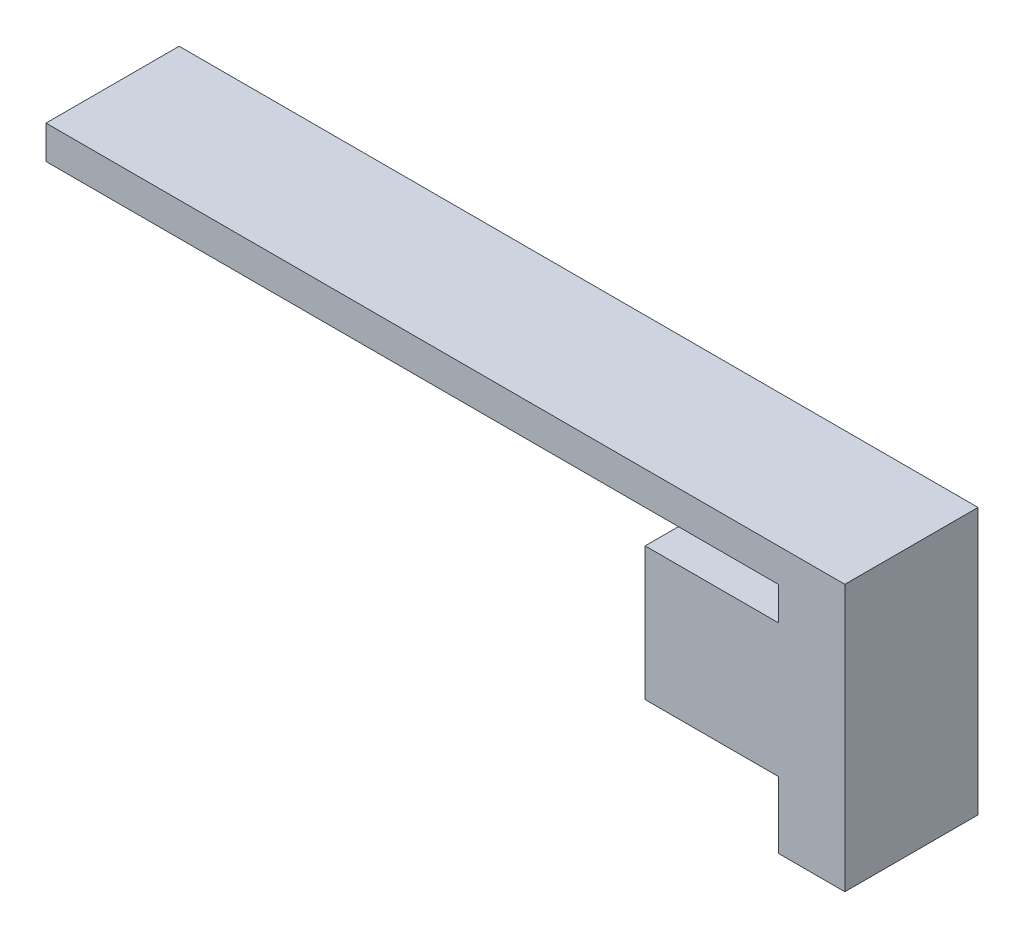
ISO-10303-21;
HEADER;
FILE_DESCRIPTION(('STEP AP214'),'2;1');
FILE_NAME('part.step','',(''),(''),'','','');
FILE_SCHEMA(('AUTOMOTIVE_DESIGN { 1 0 10303 214 1 1 1 1 }'));
ENDSEC;
DATA;
#1=APPLICATION_CONTEXT('core data for automotive mechanical design processes');
#2=APPLICATION_PROTOCOL_DEFINITION('international standard','automotive_design',2000,#1);
#3=PRODUCT_CONTEXT('',#1,'mechanical');
#4=PRODUCT('Part','Part','',(#3));
#5=PRODUCT_RELATED_PRODUCT_CATEGORY('part','',(#4));
#6=PRODUCT_DEFINITION_FORMATION('','',#4);
#7=PRODUCT_DEFINITION_CONTEXT('part definition',#1,'design');
#8=PRODUCT_DEFINITION('design','',#6,#7);
#9=PRODUCT_DEFINITION_SHAPE('','',#8);
#10=(LENGTH_UNIT() NAMED_UNIT(*) SI_UNIT(.MILLI.,.METRE.));
#11=(NAMED_UNIT(*) PLANE_ANGLE_UNIT() SI_UNIT($,.RADIAN.));
#12=(NAMED_UNIT(*) SI_UNIT($,.STERADIAN.) SOLID_ANGLE_UNIT());
#13=UNCERTAINTY_MEASURE_WITH_UNIT(LENGTH_MEASURE(1.E-05),#10,'distance_accuracy_value','');
#14=(GEOMETRIC_REPRESENTATION_CONTEXT(3) GLOBAL_UNCERTAINTY_ASSIGNED_CONTEXT((#13)) GLOBAL_UNIT_ASSIGNED_CONTEXT((#10,
#11,#12)) REPRESENTATION_CONTEXT('',''));
#15=CARTESIAN_POINT('',(0.,0.,0.));
#16=DIRECTION('',(0.,0.,1.));
#17=DIRECTION('',(1.,0.,0.));
#18=AXIS2_PLACEMENT_3D('',#15,#16,#17);
#19=CARTESIAN_POINT('',(25.,0.,0.));
#20=DIRECTION('',(1.,0.,0.));
#21=DIRECTION('',(0.,0.,-1.));
#22=AXIS2_PLACEMENT_3D('',#19,#20,#21);
#23=PLANE('',#22);
#24=DIRECTION('',(0.,0.,1.));
#25=VECTOR('',#24,1.);
#26=CARTESIAN_POINT('',(25.,-12.5,-5.));
#27=LINE('',#26,#25);
#28=CARTESIAN_POINT('',(25.,-12.5,-5.));
#29=VERTEX_POINT('',#28);
#30=CARTESIAN_POINT('',(25.,-12.5,5.));
#31=VERTEX_POINT('',#30);
#32=EDGE_CURVE('E216',#29,#31,#27,.T.);
#33=ORIENTED_EDGE('',*,*,#32,.F.);
#34=DIRECTION('',(0.,1.,0.));
#35=VECTOR('',#34,1.);
#36=CARTESIAN_POINT('',(25.,2.5,-5.));
#37=LINE('',#36,#35);
#38=CARTESIAN_POINT('',(25.,-17.5,-5.));
#39=VERTEX_POINT('',#38);
#40=EDGE_CURVE('E143',#39,#29,#37,.T.);
#41=ORIENTED_EDGE('',*,*,#40,.F.);
#42=DIRECTION('',(0.,0.,-1.));
#43=VECTOR('',#42,1.);
#44=CARTESIAN_POINT('',(25.,-17.5,5.));
#45=LINE('',#44,#43);
#46=CARTESIAN_POINT('',(25.,-17.5,5.));
#47=VERTEX_POINT('',#46);
#48=EDGE_CURVE('E160',#47,#39,#45,.T.);
#49=ORIENTED_EDGE('',*,*,#48,.F.);
#50=DIRECTION('',(0.,-1.,0.));
#51=VECTOR('',#50,1.);
#52=CARTESIAN_POINT('',(25.,2.5,5.));
#53=LINE('',#52,#51);
#54=EDGE_CURVE('E55',#31,#47,#53,.T.);
#55=ORIENTED_EDGE('',*,*,#54,.F.);
#56=EDGE_LOOP('',(#33,#41,#49,#55));
#57=FACE_BOUND('',#56,.T.);
#58=ADVANCED_FACE('F39',(#57),#23,.F.);
#59=DIRECTION('',(0.,0.,-1.));
#60=VECTOR('',#59,1.);
#61=CARTESIAN_POINT('',(25.,-2.5,-5.));
#62=LINE('',#61,#60);
#63=CARTESIAN_POINT('',(25.,-2.5,5.));
#64=VERTEX_POINT('',#63);
#65=CARTESIAN_POINT('',(25.,-2.5,-5.));
#66=VERTEX_POINT('',#65);
#67=EDGE_CURVE('E63',#64,#66,#62,.T.);
#68=ORIENTED_EDGE('',*,*,#67,.F.);
#69=CARTESIAN_POINT('',(25.,0.,5.));
#70=VERTEX_POINT('',#69);
#71=EDGE_CURVE('E148',#70,#64,#53,.T.);
#72=ORIENTED_EDGE('',*,*,#71,.F.);
#73=DIRECTION('',(0.,0.,1.));
#74=VECTOR('',#73,1.);
#75=CARTESIAN_POINT('',(25.,0.,0.));
#76=LINE('',#75,#74);
#77=CARTESIAN_POINT('',(25.,0.,-5.));
#78=VERTEX_POINT('',#77);
#79=EDGE_CURVE('E11',#78,#70,#76,.T.);
#80=ORIENTED_EDGE('',*,*,#79,.F.);
#81=EDGE_CURVE('E163',#66,#78,#37,.T.);
#82=ORIENTED_EDGE('',*,*,#81,.F.);
#83=EDGE_LOOP('',(#68,#72,#80,#82));
#84=FACE_BOUND('',#83,.T.);
#85=ADVANCED_FACE('F235',(#84),#23,.F.);
#86=CARTESIAN_POINT('',(0.,0.,0.));
#87=DIRECTION('',(0.,-1.,0.));
#88=DIRECTION('',(0.,0.,-1.));
#89=AXIS2_PLACEMENT_3D('',#86,#87,#88);
#90=PLANE('',#89);
#91=DIRECTION('',(-1.,0.,0.));
#92=VECTOR('',#91,1.);
#93=CARTESIAN_POINT('',(-30.,0.,-5.));
#94=LINE('',#93,#92);
#95=CARTESIAN_POINT('',(-30.,0.,-5.));
#96=VERTEX_POINT('',#95);
#97=EDGE_CURVE('E172',#78,#96,#94,.T.);
#98=ORIENTED_EDGE('',*,*,#97,.F.);
#99=ORIENTED_EDGE('',*,*,#79,.T.);
#100=DIRECTION('',(1.,0.,0.));
#101=VECTOR('',#100,1.);
#102=CARTESIAN_POINT('',(-30.,0.,5.));
#103=LINE('',#102,#101);
#104=CARTESIAN_POINT('',(-30.,0.,5.));
#105=VERTEX_POINT('',#104);
#106=EDGE_CURVE('E178',#105,#70,#103,.T.);
#107=ORIENTED_EDGE('',*,*,#106,.F.);
#108=DIRECTION('',(0.,0.,1.));
#109=VECTOR('',#108,1.);
#110=CARTESIAN_POINT('',(-30.,0.,5.));
#111=LINE('',#110,#109);
#112=EDGE_CURVE('E190',#96,#105,#111,.T.);
#113=ORIENTED_EDGE('',*,*,#112,.F.);
#114=EDGE_LOOP('',(#98,#99,#107,#113));
#115=FACE_BOUND('',#114,.T.);
#116=ADVANCED_FACE('F238',(#115),#90,.T.);
#117=CARTESIAN_POINT('',(30.,2.5,5.));
#118=DIRECTION('',(-1.,0.,0.));
#119=DIRECTION('',(0.,0.,1.));
#120=AXIS2_PLACEMENT_3D('',#117,#118,#119);
#121=PLANE('',#120);
#122=DIRECTION('',(0.,-1.,0.));
#123=VECTOR('',#122,1.);
#124=CARTESIAN_POINT('',(30.,2.5,5.));
#125=LINE('',#124,#123);
#126=CARTESIAN_POINT('',(30.,2.5,5.));
#127=VERTEX_POINT('',#126);
#128=CARTESIAN_POINT('',(30.,-17.5,5.));
#129=VERTEX_POINT('',#128);
#130=EDGE_CURVE('E187',#127,#129,#125,.T.);
#131=ORIENTED_EDGE('',*,*,#130,.T.);
#132=DIRECTION('',(0.,0.,-1.));
#133=VECTOR('',#132,1.);
#134=CARTESIAN_POINT('',(30.,-17.5,5.));
#135=LINE('',#134,#133);
#136=CARTESIAN_POINT('',(30.,-17.5,-5.));
#137=VERTEX_POINT('',#136);
#138=EDGE_CURVE('E154',#129,#137,#135,.T.);
#139=ORIENTED_EDGE('',*,*,#138,.T.);
#140=DIRECTION('',(0.,-1.,0.));
#141=VECTOR('',#140,1.);
#142=CARTESIAN_POINT('',(30.,2.5,-5.));
#143=LINE('',#142,#141);
#144=CARTESIAN_POINT('',(30.,2.5,-5.));
#145=VERTEX_POINT('',#144);
#146=EDGE_CURVE('E48',#145,#137,#143,.T.);
#147=ORIENTED_EDGE('',*,*,#146,.F.);
#148=DIRECTION('',(0.,0.,-1.));
#149=VECTOR('',#148,1.);
#150=CARTESIAN_POINT('',(30.,2.5,5.));
#151=LINE('',#150,#149);
#152=EDGE_CURVE('E173',#127,#145,#151,.T.);
#153=ORIENTED_EDGE('',*,*,#152,.F.);
#154=EDGE_LOOP('',(#131,#139,#147,#153));
#155=FACE_BOUND('',#154,.T.);
#156=ADVANCED_FACE('F41',(#155),#121,.F.);
#157=CARTESIAN_POINT('',(-30.,2.5,-5.));
#158=DIRECTION('',(0.,0.,1.));
#159=DIRECTION('',(1.,0.,0.));
#160=AXIS2_PLACEMENT_3D('',#157,#158,#159);
#161=PLANE('',#160);
#162=ORIENTED_EDGE('',*,*,#146,.T.);
#163=DIRECTION('',(-1.,0.,0.));
#164=VECTOR('',#163,1.);
#165=CARTESIAN_POINT('',(30.,-17.5,-5.));
#166=LINE('',#165,#164);
#167=EDGE_CURVE('E157',#137,#39,#166,.T.);
#168=ORIENTED_EDGE('',*,*,#167,.T.);
#169=ORIENTED_EDGE('',*,*,#40,.T.);
#170=DIRECTION('',(1.,0.,0.));
#171=VECTOR('',#170,1.);
#172=CARTESIAN_POINT('',(15.,-12.5,-5.));
#173=LINE('',#172,#171);
#174=CARTESIAN_POINT('',(15.,-12.5,-5.));
#175=VERTEX_POINT('',#174);
#176=EDGE_CURVE('E121',#175,#29,#173,.T.);
#177=ORIENTED_EDGE('',*,*,#176,.F.);
#178=DIRECTION('',(0.,-1.,0.));
#179=VECTOR('',#178,1.);
#180=CARTESIAN_POINT('',(15.,-2.5,-5.));
#181=LINE('',#180,#179);
#182=CARTESIAN_POINT('',(15.,-2.5,-5.));
#183=VERTEX_POINT('',#182);
#184=EDGE_CURVE('E128',#183,#175,#181,.T.);
#185=ORIENTED_EDGE('',*,*,#184,.F.);
#186=DIRECTION('',(1.,0.,0.));
#187=VECTOR('',#186,1.);
#188=CARTESIAN_POINT('',(15.,-2.5,-5.));
#189=LINE('',#188,#187);
#190=EDGE_CURVE('E224',#183,#66,#189,.T.);
#191=ORIENTED_EDGE('',*,*,#190,.T.);
#192=ORIENTED_EDGE('',*,*,#81,.T.);
#193=ORIENTED_EDGE('',*,*,#97,.T.);
#194=DIRECTION('',(0.,-1.,0.));
#195=VECTOR('',#194,1.);
#196=CARTESIAN_POINT('',(-30.,2.5,-5.));
#197=LINE('',#196,#195);
#198=CARTESIAN_POINT('',(-30.,2.5,-5.));
#199=VERTEX_POINT('',#198);
#200=EDGE_CURVE('E202',#199,#96,#197,.T.);
#201=ORIENTED_EDGE('',*,*,#200,.F.);
#202=DIRECTION('',(-1.,0.,0.));
#203=VECTOR('',#202,1.);
#204=CARTESIAN_POINT('',(-30.,2.5,-5.));
#205=LINE('',#204,#203);
#206=EDGE_CURVE('E177',#145,#199,#205,.T.);
#207=ORIENTED_EDGE('',*,*,#206,.F.);
#208=EDGE_LOOP('',(#162,#168,#169,#177,#185,#191,#192,#193,#201,#207));
#209=FACE_BOUND('',#208,.T.);
#210=ADVANCED_FACE('F140',(#209),#161,.F.);
#211=CARTESIAN_POINT('',(-30.,2.5,5.));
#212=DIRECTION('',(1.,0.,0.));
#213=DIRECTION('',(0.,0.,-1.));
#214=AXIS2_PLACEMENT_3D('',#211,#212,#213);
#215=PLANE('',#214);
#216=ORIENTED_EDGE('',*,*,#112,.T.);
#217=DIRECTION('',(0.,-1.,0.));
#218=VECTOR('',#217,1.);
#219=CARTESIAN_POINT('',(-30.,2.5,5.));
#220=LINE('',#219,#218);
#221=CARTESIAN_POINT('',(-30.,2.5,5.));
#222=VERTEX_POINT('',#221);
#223=EDGE_CURVE('E198',#222,#105,#220,.T.);
#224=ORIENTED_EDGE('',*,*,#223,.F.);
#225=DIRECTION('',(0.,0.,1.));
#226=VECTOR('',#225,1.);
#227=CARTESIAN_POINT('',(-30.,2.5,5.));
#228=LINE('',#227,#226);
#229=EDGE_CURVE('E181',#199,#222,#228,.T.);
#230=ORIENTED_EDGE('',*,*,#229,.F.);
#231=ORIENTED_EDGE('',*,*,#200,.T.);
#232=EDGE_LOOP('',(#216,#224,#230,#231));
#233=FACE_BOUND('',#232,.T.);
#234=ADVANCED_FACE('F242',(#233),#215,.F.);
#235=CARTESIAN_POINT('',(-30.,2.5,5.));
#236=DIRECTION('',(0.,0.,-1.));
#237=DIRECTION('',(-1.,0.,0.));
#238=AXIS2_PLACEMENT_3D('',#235,#236,#237);
#239=PLANE('',#238);
#240=ORIENTED_EDGE('',*,*,#130,.F.);
#241=DIRECTION('',(1.,0.,0.));
#242=VECTOR('',#241,1.);
#243=CARTESIAN_POINT('',(-30.,2.5,5.));
#244=LINE('',#243,#242);
#245=EDGE_CURVE('E184',#222,#127,#244,.T.);
#246=ORIENTED_EDGE('',*,*,#245,.F.);
#247=ORIENTED_EDGE('',*,*,#223,.T.);
#248=ORIENTED_EDGE('',*,*,#106,.T.);
#249=ORIENTED_EDGE('',*,*,#71,.T.);
#250=DIRECTION('',(1.,0.,0.));
#251=VECTOR('',#250,1.);
#252=CARTESIAN_POINT('',(15.,-2.5,5.));
#253=LINE('',#252,#251);
#254=CARTESIAN_POINT('',(15.,-2.5,5.));
#255=VERTEX_POINT('',#254);
#256=EDGE_CURVE('E150',#255,#64,#253,.T.);
#257=ORIENTED_EDGE('',*,*,#256,.F.);
#258=DIRECTION('',(0.,1.,0.));
#259=VECTOR('',#258,1.);
#260=CARTESIAN_POINT('',(15.,-2.5,5.));
#261=LINE('',#260,#259);
#262=CARTESIAN_POINT('',(15.,-12.5,5.));
#263=VERTEX_POINT('',#262);
#264=EDGE_CURVE('E127',#263,#255,#261,.T.);
#265=ORIENTED_EDGE('',*,*,#264,.F.);
#266=DIRECTION('',(1.,0.,0.));
#267=VECTOR('',#266,1.);
#268=CARTESIAN_POINT('',(15.,-12.5,5.));
#269=LINE('',#268,#267);
#270=EDGE_CURVE('E123',#263,#31,#269,.T.);
#271=ORIENTED_EDGE('',*,*,#270,.T.);
#272=ORIENTED_EDGE('',*,*,#54,.T.);
#273=DIRECTION('',(-1.,0.,0.));
#274=VECTOR('',#273,1.);
#275=CARTESIAN_POINT('',(30.,-17.5,5.));
#276=LINE('',#275,#274);
#277=EDGE_CURVE('E168',#129,#47,#276,.T.);
#278=ORIENTED_EDGE('',*,*,#277,.F.);
#279=EDGE_LOOP('',(#240,#246,#247,#248,#249,#257,#265,#271,#272,#278));
#280=FACE_BOUND('',#279,.T.);
#281=ADVANCED_FACE('F232',(#280),#239,.F.);
#282=CARTESIAN_POINT('',(0.,2.5,0.));
#283=DIRECTION('',(0.,-1.,0.));
#284=DIRECTION('',(0.,0.,-1.));
#285=AXIS2_PLACEMENT_3D('',#282,#283,#284);
#286=PLANE('',#285);
#287=ORIENTED_EDGE('',*,*,#206,.T.);
#288=ORIENTED_EDGE('',*,*,#229,.T.);
#289=ORIENTED_EDGE('',*,*,#245,.T.);
#290=ORIENTED_EDGE('',*,*,#152,.T.);
#291=EDGE_LOOP('',(#287,#288,#289,#290));
#292=FACE_BOUND('',#291,.T.);
#293=ADVANCED_FACE('F246',(#292),#286,.F.);
#294=CARTESIAN_POINT('',(30.,-17.5,5.));
#295=DIRECTION('',(0.,1.,0.));
#296=DIRECTION('',(0.,0.,1.));
#297=AXIS2_PLACEMENT_3D('',#294,#295,#296);
#298=PLANE('',#297);
#299=ORIENTED_EDGE('',*,*,#48,.T.);
#300=ORIENTED_EDGE('',*,*,#167,.F.);
#301=ORIENTED_EDGE('',*,*,#138,.F.);
#302=ORIENTED_EDGE('',*,*,#277,.T.);
#303=EDGE_LOOP('',(#299,#300,#301,#302));
#304=FACE_BOUND('',#303,.T.);
#305=ADVANCED_FACE('F215',(#304),#298,.F.);
#306=CARTESIAN_POINT('',(15.,-12.5,-5.));
#307=DIRECTION('',(0.,1.,0.));
#308=DIRECTION('',(0.,0.,1.));
#309=AXIS2_PLACEMENT_3D('',#306,#307,#308);
#310=PLANE('',#309);
#311=ORIENTED_EDGE('',*,*,#32,.T.);
#312=ORIENTED_EDGE('',*,*,#270,.F.);
#313=DIRECTION('',(0.,0.,1.));
#314=VECTOR('',#313,1.);
#315=CARTESIAN_POINT('',(15.,-12.5,-5.));
#316=LINE('',#315,#314);
#317=EDGE_CURVE('E117',#175,#263,#316,.T.);
#318=ORIENTED_EDGE('',*,*,#317,.F.);
#319=ORIENTED_EDGE('',*,*,#176,.T.);
#320=EDGE_LOOP('',(#311,#312,#318,#319));
#321=FACE_BOUND('',#320,.T.);
#322=ADVANCED_FACE('F119',(#321),#310,.F.);
#323=CARTESIAN_POINT('',(15.,-2.5,-5.));
#324=DIRECTION('',(0.,-1.,0.));
#325=DIRECTION('',(0.,0.,-1.));
#326=AXIS2_PLACEMENT_3D('',#323,#324,#325);
#327=PLANE('',#326);
#328=ORIENTED_EDGE('',*,*,#67,.T.);
#329=ORIENTED_EDGE('',*,*,#190,.F.);
#330=DIRECTION('',(0.,0.,-1.));
#331=VECTOR('',#330,1.);
#332=CARTESIAN_POINT('',(15.,-2.5,-5.));
#333=LINE('',#332,#331);
#334=EDGE_CURVE('E133',#255,#183,#333,.T.);
#335=ORIENTED_EDGE('',*,*,#334,.F.);
#336=ORIENTED_EDGE('',*,*,#256,.T.);
#337=EDGE_LOOP('',(#328,#329,#335,#336));
#338=FACE_BOUND('',#337,.T.);
#339=ADVANCED_FACE('F230',(#338),#327,.F.);
#340=CARTESIAN_POINT('',(15.,0.,0.));
#341=DIRECTION('',(-1.,0.,0.));
#342=DIRECTION('',(0.,0.,1.));
#343=AXIS2_PLACEMENT_3D('',#340,#341,#342);
#344=PLANE('',#343);
#345=ORIENTED_EDGE('',*,*,#184,.T.);
#346=ORIENTED_EDGE('',*,*,#317,.T.);
#347=ORIENTED_EDGE('',*,*,#264,.T.);
#348=ORIENTED_EDGE('',*,*,#334,.T.);
#349=EDGE_LOOP('',(#345,#346,#347,#348));
#350=FACE_BOUND('',#349,.T.);
#351=ADVANCED_FACE('F131',(#350),#344,.T.);
#352=CLOSED_SHELL('',(#58,#85,#116,#156,#210,#234,#281,#293,#305,#322,#339,#351));
#353=MANIFOLD_SOLID_BREP('B2',#352);
#354=ADVANCED_BREP_SHAPE_REPRESENTATION('',(#18,#353),#14);
#355=SHAPE_DEFINITION_REPRESENTATION(#9,#354);
ENDSEC;
END-ISO-10303-21;
